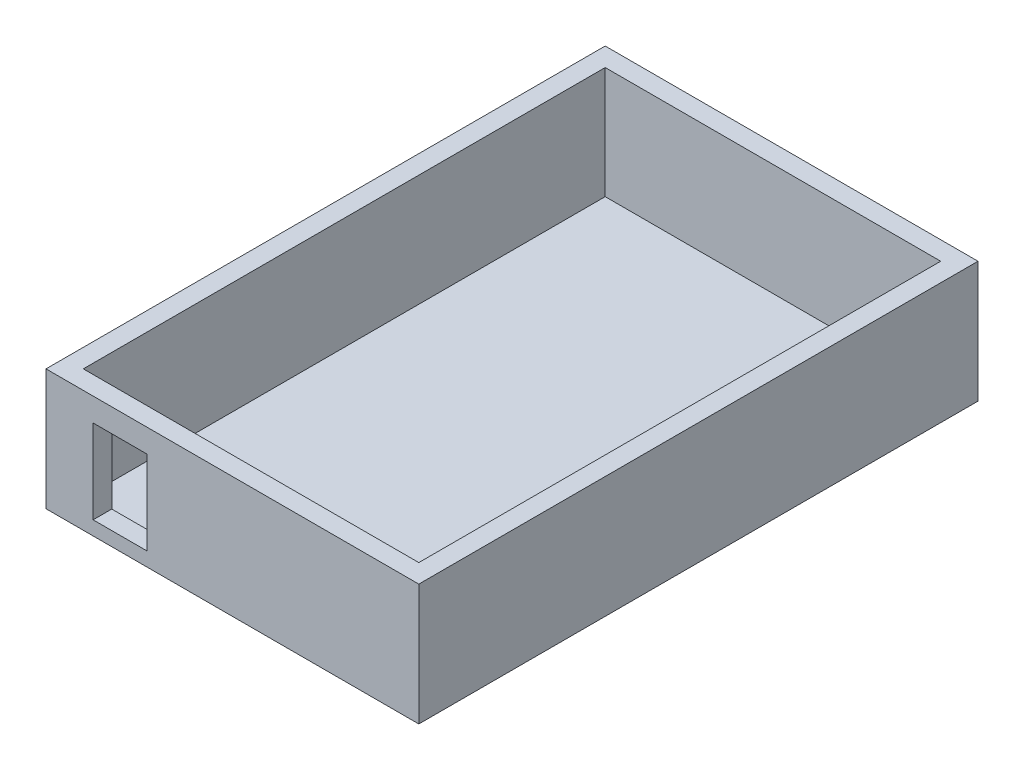
ISO-10303-21;
HEADER;
FILE_DESCRIPTION(('STEP AP214'),'2;1');
FILE_NAME('part.step','',(''),(''),'','','');
FILE_SCHEMA(('AUTOMOTIVE_DESIGN { 1 0 10303 214 1 1 1 1 }'));
ENDSEC;
DATA;
#1=APPLICATION_CONTEXT('core data for automotive mechanical design processes');
#2=APPLICATION_PROTOCOL_DEFINITION('international standard','automotive_design',2000,#1);
#3=PRODUCT_CONTEXT('',#1,'mechanical');
#4=PRODUCT('Part','Part','',(#3));
#5=PRODUCT_RELATED_PRODUCT_CATEGORY('part','',(#4));
#6=PRODUCT_DEFINITION_FORMATION('','',#4);
#7=PRODUCT_DEFINITION_CONTEXT('part definition',#1,'design');
#8=PRODUCT_DEFINITION('design','',#6,#7);
#9=PRODUCT_DEFINITION_SHAPE('','',#8);
#10=(LENGTH_UNIT() NAMED_UNIT(*) SI_UNIT(.MILLI.,.METRE.));
#11=(NAMED_UNIT(*) PLANE_ANGLE_UNIT() SI_UNIT($,.RADIAN.));
#12=(NAMED_UNIT(*) SI_UNIT($,.STERADIAN.) SOLID_ANGLE_UNIT());
#13=UNCERTAINTY_MEASURE_WITH_UNIT(LENGTH_MEASURE(1.E-05),#10,'distance_accuracy_value','');
#14=(GEOMETRIC_REPRESENTATION_CONTEXT(3) GLOBAL_UNCERTAINTY_ASSIGNED_CONTEXT((#13)) GLOBAL_UNIT_ASSIGNED_CONTEXT((#10,
#11,#12)) REPRESENTATION_CONTEXT('',''));
#15=CARTESIAN_POINT('',(0.,0.,0.));
#16=DIRECTION('',(0.,0.,1.));
#17=DIRECTION('',(1.,0.,0.));
#18=AXIS2_PLACEMENT_3D('',#15,#16,#17);
#19=CARTESIAN_POINT('',(0.,250.,0.));
#20=DIRECTION('',(0.,1.,0.));
#21=DIRECTION('',(0.,0.,1.));
#22=AXIS2_PLACEMENT_3D('',#19,#20,#21);
#23=PLANE('',#22);
#24=DIRECTION('',(0.,0.,1.));
#25=VECTOR('',#24,1.);
#26=CARTESIAN_POINT('',(-399.833055091823,250.,-14442.4040066778));
#27=LINE('',#26,#25);
#28=CARTESIAN_POINT('',(-399.833055091823,250.,-14442.4040066778));
#29=VERTEX_POINT('',#28);
#30=CARTESIAN_POINT('',(-399.833055091821,250.,-442.404006677796));
#31=VERTEX_POINT('',#30);
#32=EDGE_CURVE('E186',#29,#31,#27,.T.);
#33=ORIENTED_EDGE('',*,*,#32,.F.);
#34=DIRECTION('',(1.,0.,0.));
#35=VECTOR('',#34,1.);
#36=CARTESIAN_POINT('',(-9899.83305509182,250.,-14442.4040066778));
#37=LINE('',#36,#35);
#38=CARTESIAN_POINT('',(-9399.83305509182,250.,-14442.4040066778));
#39=VERTEX_POINT('',#38);
#40=EDGE_CURVE('E177',#39,#29,#37,.T.);
#41=ORIENTED_EDGE('',*,*,#40,.F.);
#42=DIRECTION('',(0.,0.,-1.));
#43=VECTOR('',#42,1.);
#44=CARTESIAN_POINT('',(-9399.83305509182,250.,-14442.4040066778));
#45=LINE('',#44,#43);
#46=CARTESIAN_POINT('',(-9399.83305509182,250.,-442.404006677809));
#47=VERTEX_POINT('',#46);
#48=EDGE_CURVE('E200',#47,#39,#45,.T.);
#49=ORIENTED_EDGE('',*,*,#48,.F.);
#50=DIRECTION('',(-1.,0.,0.));
#51=VECTOR('',#50,1.);
#52=CARTESIAN_POINT('',(-9899.83305509182,250.,-442.404006677796));
#53=LINE('',#52,#51);
#54=EDGE_CURVE('E218',#31,#47,#53,.T.);
#55=ORIENTED_EDGE('',*,*,#54,.F.);
#56=EDGE_LOOP('',(#33,#41,#49,#55));
#57=FACE_BOUND('',#56,.T.);
#58=ADVANCED_FACE('F39',(#57),#23,.T.);
#59=CARTESIAN_POINT('',(-9899.83305509182,3250.,-442.404006677796));
#60=DIRECTION('',(0.,0.,1.));
#61=DIRECTION('',(1.,0.,0.));
#62=AXIS2_PLACEMENT_3D('',#59,#60,#61);
#63=PLANE('',#62);
#64=DIRECTION('',(1.,0.,0.));
#65=VECTOR('',#64,1.);
#66=CARTESIAN_POINT('',(-9899.83305509182,374.999999999997,-442.404006677796));
#67=LINE('',#66,#65);
#68=CARTESIAN_POINT('',(-8636.05304999143,374.999999999998,-442.404006677796));
#69=VERTEX_POINT('',#68);
#70=CARTESIAN_POINT('',(-7188.26780196783,374.999999999998,-442.404006677796));
#71=VERTEX_POINT('',#70);
#72=EDGE_CURVE('E169',#69,#71,#67,.T.);
#73=ORIENTED_EDGE('',*,*,#72,.T.);
#74=DIRECTION('',(0.,1.,0.));
#75=VECTOR('',#74,1.);
#76=CARTESIAN_POINT('',(-7188.26780196784,3250.,-442.404006677796));
#77=LINE('',#76,#75);
#78=CARTESIAN_POINT('',(-7188.26780196784,2625.,-442.404006677796));
#79=VERTEX_POINT('',#78);
#80=EDGE_CURVE('E173',#71,#79,#77,.T.);
#81=ORIENTED_EDGE('',*,*,#80,.T.);
#82=DIRECTION('',(-1.,0.,0.));
#83=VECTOR('',#82,1.);
#84=CARTESIAN_POINT('',(-9899.83305509182,2625.,-442.404006677796));
#85=LINE('',#84,#83);
#86=CARTESIAN_POINT('',(-8636.05304999143,2625.,-442.404006677796));
#87=VERTEX_POINT('',#86);
#88=EDGE_CURVE('E160',#79,#87,#85,.T.);
#89=ORIENTED_EDGE('',*,*,#88,.T.);
#90=DIRECTION('',(0.,-1.,0.));
#91=VECTOR('',#90,1.);
#92=CARTESIAN_POINT('',(-8636.05304999143,3250.,-442.404006677796));
#93=LINE('',#92,#91);
#94=EDGE_CURVE('E135',#87,#69,#93,.T.);
#95=ORIENTED_EDGE('',*,*,#94,.T.);
#96=EDGE_LOOP('',(#73,#81,#89,#95));
#97=FACE_BOUND('',#96,.T.);
#98=DIRECTION('',(0.,-1.,0.));
#99=VECTOR('',#98,1.);
#100=CARTESIAN_POINT('',(-399.833055091821,3250.,-442.404006677796));
#101=LINE('',#100,#99);
#102=CARTESIAN_POINT('',(-399.83305509182,3250.,-442.404006677796));
#103=VERTEX_POINT('',#102);
#104=EDGE_CURVE('E193',#103,#31,#101,.T.);
#105=ORIENTED_EDGE('',*,*,#104,.T.);
#106=ORIENTED_EDGE('',*,*,#54,.T.);
#107=DIRECTION('',(0.,-1.,0.));
#108=VECTOR('',#107,1.);
#109=CARTESIAN_POINT('',(-9399.83305509182,3250.,-442.404006677809));
#110=LINE('',#109,#108);
#111=CARTESIAN_POINT('',(-9399.83305509182,3250.,-442.404006677809));
#112=VERTEX_POINT('',#111);
#113=EDGE_CURVE('E208',#112,#47,#110,.T.);
#114=ORIENTED_EDGE('',*,*,#113,.F.);
#115=DIRECTION('',(-1.,0.,0.));
#116=VECTOR('',#115,1.);
#117=CARTESIAN_POINT('',(-9899.83305509182,3250.,-442.404006677796));
#118=LINE('',#117,#116);
#119=EDGE_CURVE('E223',#103,#112,#118,.T.);
#120=ORIENTED_EDGE('',*,*,#119,.F.);
#121=EDGE_LOOP('',(#105,#106,#114,#120));
#122=FACE_BOUND('',#121,.T.);
#123=ADVANCED_FACE('F281',(#97,#122),#63,.F.);
#124=CARTESIAN_POINT('',(100.166944908178,250.,-14942.4040066778));
#125=DIRECTION('',(-1.,0.,0.));
#126=DIRECTION('',(0.,0.,1.));
#127=AXIS2_PLACEMENT_3D('',#124,#125,#126);
#128=PLANE('',#127);
#129=DIRECTION('',(0.,-1.,0.));
#130=VECTOR('',#129,1.);
#131=CARTESIAN_POINT('',(100.166944908178,250.,-14942.4040066778));
#132=LINE('',#131,#130);
#133=CARTESIAN_POINT('',(100.166944908178,3250.,-14942.4040066778));
#134=VERTEX_POINT('',#133);
#135=CARTESIAN_POINT('',(100.166944908178,0.,-14942.4040066778));
#136=VERTEX_POINT('',#135);
#137=EDGE_CURVE('E11',#134,#136,#132,.T.);
#138=ORIENTED_EDGE('',*,*,#137,.F.);
#139=DIRECTION('',(0.,0.,-1.));
#140=VECTOR('',#139,1.);
#141=CARTESIAN_POINT('',(100.16694490818,3250.,-442.404006677796));
#142=LINE('',#141,#140);
#143=CARTESIAN_POINT('',(100.16694490818,3250.,57.5959933222037));
#144=VERTEX_POINT('',#143);
#145=EDGE_CURVE('E219',#144,#134,#142,.T.);
#146=ORIENTED_EDGE('',*,*,#145,.F.);
#147=DIRECTION('',(0.,-1.,0.));
#148=VECTOR('',#147,1.);
#149=CARTESIAN_POINT('',(100.16694490818,250.,57.5959933222037));
#150=LINE('',#149,#148);
#151=CARTESIAN_POINT('',(100.16694490818,0.,57.5959933222037));
#152=VERTEX_POINT('',#151);
#153=EDGE_CURVE('E249',#144,#152,#150,.T.);
#154=ORIENTED_EDGE('',*,*,#153,.T.);
#155=DIRECTION('',(0.,0.,-1.));
#156=VECTOR('',#155,1.);
#157=CARTESIAN_POINT('',(100.166944908178,0.,-14942.4040066778));
#158=LINE('',#157,#156);
#159=EDGE_CURVE('E234',#152,#136,#158,.T.);
#160=ORIENTED_EDGE('',*,*,#159,.T.);
#161=EDGE_LOOP('',(#138,#146,#154,#160));
#162=FACE_BOUND('',#161,.T.);
#163=ADVANCED_FACE('F41',(#162),#128,.F.);
#164=CARTESIAN_POINT('',(-9899.83305509182,250.,-14942.4040066778));
#165=DIRECTION('',(0.,0.,1.));
#166=DIRECTION('',(1.,0.,0.));
#167=AXIS2_PLACEMENT_3D('',#164,#165,#166);
#168=PLANE('',#167);
#169=DIRECTION('',(-1.,0.,0.));
#170=VECTOR('',#169,1.);
#171=CARTESIAN_POINT('',(-9899.83305509182,0.,-14942.4040066778));
#172=LINE('',#171,#170);
#173=CARTESIAN_POINT('',(-9899.83305509182,0.,-14942.4040066778));
#174=VERTEX_POINT('',#173);
#175=EDGE_CURVE('E240',#136,#174,#172,.T.);
#176=ORIENTED_EDGE('',*,*,#175,.T.);
#177=DIRECTION('',(0.,-1.,0.));
#178=VECTOR('',#177,1.);
#179=CARTESIAN_POINT('',(-9899.83305509182,250.,-14942.4040066778));
#180=LINE('',#179,#178);
#181=CARTESIAN_POINT('',(-9899.83305509182,3250.,-14942.4040066778));
#182=VERTEX_POINT('',#181);
#183=EDGE_CURVE('E48',#182,#174,#180,.T.);
#184=ORIENTED_EDGE('',*,*,#183,.F.);
#185=DIRECTION('',(-1.,0.,0.));
#186=VECTOR('',#185,1.);
#187=CARTESIAN_POINT('',(-9899.83305509182,3250.,-14942.4040066778));
#188=LINE('',#187,#186);
#189=EDGE_CURVE('E178',#134,#182,#188,.T.);
#190=ORIENTED_EDGE('',*,*,#189,.F.);
#191=ORIENTED_EDGE('',*,*,#137,.T.);
#192=EDGE_LOOP('',(#176,#184,#190,#191));
#193=FACE_BOUND('',#192,.T.);
#194=ADVANCED_FACE('F274',(#193),#168,.F.);
#195=CARTESIAN_POINT('',(-9899.83305509182,250.,-14942.4040066778));
#196=DIRECTION('',(1.,0.,0.));
#197=DIRECTION('',(0.,0.,-1.));
#198=AXIS2_PLACEMENT_3D('',#195,#196,#197);
#199=PLANE('',#198);
#200=DIRECTION('',(0.,0.,1.));
#201=VECTOR('',#200,1.);
#202=CARTESIAN_POINT('',(-9899.83305509182,0.,-14942.4040066778));
#203=LINE('',#202,#201);
#204=CARTESIAN_POINT('',(-9899.83305509182,0.,57.5959933222037));
#205=VERTEX_POINT('',#204);
#206=EDGE_CURVE('E243',#174,#205,#203,.T.);
#207=ORIENTED_EDGE('',*,*,#206,.T.);
#208=DIRECTION('',(0.,-1.,0.));
#209=VECTOR('',#208,1.);
#210=CARTESIAN_POINT('',(-9899.83305509182,250.,57.5959933222037));
#211=LINE('',#210,#209);
#212=CARTESIAN_POINT('',(-9899.83305509182,3250.,57.5959933222037));
#213=VERTEX_POINT('',#212);
#214=EDGE_CURVE('E253',#213,#205,#211,.T.);
#215=ORIENTED_EDGE('',*,*,#214,.F.);
#216=DIRECTION('',(0.,0.,1.));
#217=VECTOR('',#216,1.);
#218=CARTESIAN_POINT('',(-9899.83305509182,3250.,-442.404006677796));
#219=LINE('',#218,#217);
#220=EDGE_CURVE('E226',#182,#213,#219,.T.);
#221=ORIENTED_EDGE('',*,*,#220,.F.);
#222=ORIENTED_EDGE('',*,*,#183,.T.);
#223=EDGE_LOOP('',(#207,#215,#221,#222));
#224=FACE_BOUND('',#223,.T.);
#225=ADVANCED_FACE('F261',(#224),#199,.F.);
#226=CARTESIAN_POINT('',(-9899.83305509182,250.,57.5959933222037));
#227=DIRECTION('',(0.,0.,-1.));
#228=DIRECTION('',(-1.,0.,0.));
#229=AXIS2_PLACEMENT_3D('',#226,#227,#228);
#230=PLANE('',#229);
#231=DIRECTION('',(-1.,0.,0.));
#232=VECTOR('',#231,1.);
#233=CARTESIAN_POINT('',(-8636.05304999143,2625.,57.5959933222037));
#234=LINE('',#233,#232);
#235=CARTESIAN_POINT('',(-7188.26780196784,2625.,57.5959933222037));
#236=VERTEX_POINT('',#235);
#237=CARTESIAN_POINT('',(-8636.05304999143,2625.,57.5959933222037));
#238=VERTEX_POINT('',#237);
#239=EDGE_CURVE('E142',#236,#238,#234,.T.);
#240=ORIENTED_EDGE('',*,*,#239,.F.);
#241=DIRECTION('',(0.,1.,0.));
#242=VECTOR('',#241,1.);
#243=CARTESIAN_POINT('',(-7188.26780196784,2625.,57.5959933222037));
#244=LINE('',#243,#242);
#245=CARTESIAN_POINT('',(-7188.26780196783,374.999999999998,57.5959933222037));
#246=VERTEX_POINT('',#245);
#247=EDGE_CURVE('E63',#246,#236,#244,.T.);
#248=ORIENTED_EDGE('',*,*,#247,.F.);
#249=DIRECTION('',(1.,0.,0.));
#250=VECTOR('',#249,1.);
#251=CARTESIAN_POINT('',(-8636.05304999143,374.999999999998,57.5959933222037));
#252=LINE('',#251,#250);
#253=CARTESIAN_POINT('',(-8636.05304999143,374.999999999998,57.5959933222037));
#254=VERTEX_POINT('',#253);
#255=EDGE_CURVE('E150',#254,#246,#252,.T.);
#256=ORIENTED_EDGE('',*,*,#255,.F.);
#257=DIRECTION('',(0.,-1.,0.));
#258=VECTOR('',#257,1.);
#259=CARTESIAN_POINT('',(-8636.05304999143,2625.,57.5959933222037));
#260=LINE('',#259,#258);
#261=EDGE_CURVE('E132',#238,#254,#260,.T.);
#262=ORIENTED_EDGE('',*,*,#261,.F.);
#263=EDGE_LOOP('',(#240,#248,#256,#262));
#264=FACE_BOUND('',#263,.T.);
#265=DIRECTION('',(1.,0.,0.));
#266=VECTOR('',#265,1.);
#267=CARTESIAN_POINT('',(-9899.83305509182,0.,57.5959933222037));
#268=LINE('',#267,#266);
#269=EDGE_CURVE('E246',#205,#152,#268,.T.);
#270=ORIENTED_EDGE('',*,*,#269,.T.);
#271=ORIENTED_EDGE('',*,*,#153,.F.);
#272=DIRECTION('',(1.,0.,0.));
#273=VECTOR('',#272,1.);
#274=CARTESIAN_POINT('',(-9899.83305509182,3250.,57.5959933222037));
#275=LINE('',#274,#273);
#276=EDGE_CURVE('E230',#213,#144,#275,.T.);
#277=ORIENTED_EDGE('',*,*,#276,.F.);
#278=ORIENTED_EDGE('',*,*,#214,.T.);
#279=EDGE_LOOP('',(#270,#271,#277,#278));
#280=FACE_BOUND('',#279,.T.);
#281=ADVANCED_FACE('F147',(#264,#280),#230,.F.);
#282=CARTESIAN_POINT('',(0.,0.,0.));
#283=DIRECTION('',(0.,1.,0.));
#284=DIRECTION('',(0.,0.,1.));
#285=AXIS2_PLACEMENT_3D('',#282,#283,#284);
#286=PLANE('',#285);
#287=ORIENTED_EDGE('',*,*,#159,.F.);
#288=ORIENTED_EDGE('',*,*,#269,.F.);
#289=ORIENTED_EDGE('',*,*,#206,.F.);
#290=ORIENTED_EDGE('',*,*,#175,.F.);
#291=EDGE_LOOP('',(#287,#288,#289,#290));
#292=FACE_BOUND('',#291,.T.);
#293=ADVANCED_FACE('F267',(#292),#286,.F.);
#294=CARTESIAN_POINT('',(0.,3250.,0.));
#295=DIRECTION('',(0.,1.,0.));
#296=DIRECTION('',(0.,0.,1.));
#297=AXIS2_PLACEMENT_3D('',#294,#295,#296);
#298=PLANE('',#297);
#299=ORIENTED_EDGE('',*,*,#189,.T.);
#300=ORIENTED_EDGE('',*,*,#220,.T.);
#301=ORIENTED_EDGE('',*,*,#276,.T.);
#302=ORIENTED_EDGE('',*,*,#145,.T.);
#303=EDGE_LOOP('',(#299,#300,#301,#302));
#304=FACE_BOUND('',#303,.T.);
#305=DIRECTION('',(0.,0.,-1.));
#306=VECTOR('',#305,1.);
#307=CARTESIAN_POINT('',(-9399.83305509182,3250.,-14442.4040066778));
#308=LINE('',#307,#306);
#309=CARTESIAN_POINT('',(-9399.83305509182,3250.,-14442.4040066778));
#310=VERTEX_POINT('',#309);
#311=EDGE_CURVE('E204',#112,#310,#308,.T.);
#312=ORIENTED_EDGE('',*,*,#311,.T.);
#313=DIRECTION('',(1.,0.,0.));
#314=VECTOR('',#313,1.);
#315=CARTESIAN_POINT('',(-9899.83305509182,3250.,-14442.4040066778));
#316=LINE('',#315,#314);
#317=CARTESIAN_POINT('',(-399.833055091822,3250.,-14442.4040066778));
#318=VERTEX_POINT('',#317);
#319=EDGE_CURVE('E182',#310,#318,#316,.T.);
#320=ORIENTED_EDGE('',*,*,#319,.T.);
#321=DIRECTION('',(0.,0.,1.));
#322=VECTOR('',#321,1.);
#323=CARTESIAN_POINT('',(-399.833055091823,3250.,-14442.4040066778));
#324=LINE('',#323,#322);
#325=EDGE_CURVE('E189',#318,#103,#324,.T.);
#326=ORIENTED_EDGE('',*,*,#325,.T.);
#327=ORIENTED_EDGE('',*,*,#119,.T.);
#328=EDGE_LOOP('',(#312,#320,#326,#327));
#329=FACE_BOUND('',#328,.T.);
#330=ADVANCED_FACE('F272',(#304,#329),#298,.T.);
#331=CARTESIAN_POINT('',(-9399.83305509182,3250.,-14442.4040066778));
#332=DIRECTION('',(-1.,0.,0.));
#333=DIRECTION('',(0.,0.,1.));
#334=AXIS2_PLACEMENT_3D('',#331,#332,#333);
#335=PLANE('',#334);
#336=ORIENTED_EDGE('',*,*,#48,.T.);
#337=DIRECTION('',(0.,-1.,0.));
#338=VECTOR('',#337,1.);
#339=CARTESIAN_POINT('',(-9399.83305509182,3250.,-14442.4040066778));
#340=LINE('',#339,#338);
#341=EDGE_CURVE('E215',#310,#39,#340,.T.);
#342=ORIENTED_EDGE('',*,*,#341,.F.);
#343=ORIENTED_EDGE('',*,*,#311,.F.);
#344=ORIENTED_EDGE('',*,*,#113,.T.);
#345=EDGE_LOOP('',(#336,#342,#343,#344));
#346=FACE_BOUND('',#345,.T.);
#347=ADVANCED_FACE('F312',(#346),#335,.F.);
#348=CARTESIAN_POINT('',(-399.833055091823,3250.,-14442.4040066778));
#349=DIRECTION('',(1.,0.,0.));
#350=DIRECTION('',(0.,0.,-1.));
#351=AXIS2_PLACEMENT_3D('',#348,#349,#350);
#352=PLANE('',#351);
#353=ORIENTED_EDGE('',*,*,#32,.T.);
#354=ORIENTED_EDGE('',*,*,#104,.F.);
#355=ORIENTED_EDGE('',*,*,#325,.F.);
#356=DIRECTION('',(0.,-1.,0.));
#357=VECTOR('',#356,1.);
#358=CARTESIAN_POINT('',(-399.833055091823,3250.,-14442.4040066778));
#359=LINE('',#358,#357);
#360=EDGE_CURVE('E196',#318,#29,#359,.T.);
#361=ORIENTED_EDGE('',*,*,#360,.T.);
#362=EDGE_LOOP('',(#353,#354,#355,#361));
#363=FACE_BOUND('',#362,.T.);
#364=ADVANCED_FACE('F318',(#363),#352,.F.);
#365=CARTESIAN_POINT('',(-9899.83305509182,3250.,-14442.4040066778));
#366=DIRECTION('',(0.,0.,-1.));
#367=DIRECTION('',(-1.,0.,0.));
#368=AXIS2_PLACEMENT_3D('',#365,#366,#367);
#369=PLANE('',#368);
#370=ORIENTED_EDGE('',*,*,#319,.F.);
#371=ORIENTED_EDGE('',*,*,#341,.T.);
#372=ORIENTED_EDGE('',*,*,#40,.T.);
#373=ORIENTED_EDGE('',*,*,#360,.F.);
#374=EDGE_LOOP('',(#370,#371,#372,#373));
#375=FACE_BOUND('',#374,.T.);
#376=ADVANCED_FACE('F326',(#375),#369,.F.);
#377=CARTESIAN_POINT('',(-7188.26780196784,2625.,-1942.4040066778));
#378=DIRECTION('',(1.,0.,0.));
#379=DIRECTION('',(0.,1.,0.));
#380=AXIS2_PLACEMENT_3D('',#377,#378,#379);
#381=PLANE('',#380);
#382=DIRECTION('',(0.,0.,1.));
#383=VECTOR('',#382,1.);
#384=CARTESIAN_POINT('',(-7188.26780196783,374.999999999998,-1942.4040066778));
#385=LINE('',#384,#383);
#386=EDGE_CURVE('E157',#71,#246,#385,.T.);
#387=ORIENTED_EDGE('',*,*,#386,.T.);
#388=ORIENTED_EDGE('',*,*,#247,.T.);
#389=DIRECTION('',(0.,0.,1.));
#390=VECTOR('',#389,1.);
#391=CARTESIAN_POINT('',(-7188.26780196784,2625.,-1942.4040066778));
#392=LINE('',#391,#390);
#393=EDGE_CURVE('E139',#79,#236,#392,.T.);
#394=ORIENTED_EDGE('',*,*,#393,.F.);
#395=ORIENTED_EDGE('',*,*,#80,.F.);
#396=EDGE_LOOP('',(#387,#388,#394,#395));
#397=FACE_BOUND('',#396,.T.);
#398=ADVANCED_FACE('F334',(#397),#381,.F.);
#399=CARTESIAN_POINT('',(-8636.05304999143,374.999999999998,-1942.4040066778));
#400=DIRECTION('',(0.,-1.,0.));
#401=DIRECTION('',(1.,0.,0.));
#402=AXIS2_PLACEMENT_3D('',#399,#400,#401);
#403=PLANE('',#402);
#404=DIRECTION('',(0.,0.,1.));
#405=VECTOR('',#404,1.);
#406=CARTESIAN_POINT('',(-8636.05304999143,374.999999999998,-1942.4040066778));
#407=LINE('',#406,#405);
#408=EDGE_CURVE('E138',#69,#254,#407,.T.);
#409=ORIENTED_EDGE('',*,*,#408,.T.);
#410=ORIENTED_EDGE('',*,*,#255,.T.);
#411=ORIENTED_EDGE('',*,*,#386,.F.);
#412=ORIENTED_EDGE('',*,*,#72,.F.);
#413=EDGE_LOOP('',(#409,#410,#411,#412));
#414=FACE_BOUND('',#413,.T.);
#415=ADVANCED_FACE('F341',(#414),#403,.F.);
#416=CARTESIAN_POINT('',(-8636.05304999143,2625.,-1942.4040066778));
#417=DIRECTION('',(-1.,0.,0.));
#418=DIRECTION('',(0.,0.,1.));
#419=AXIS2_PLACEMENT_3D('',#416,#417,#418);
#420=PLANE('',#419);
#421=DIRECTION('',(0.,0.,1.));
#422=VECTOR('',#421,1.);
#423=CARTESIAN_POINT('',(-8636.05304999143,2625.,-1942.4040066778));
#424=LINE('',#423,#422);
#425=EDGE_CURVE('E55',#87,#238,#424,.T.);
#426=ORIENTED_EDGE('',*,*,#425,.T.);
#427=ORIENTED_EDGE('',*,*,#261,.T.);
#428=ORIENTED_EDGE('',*,*,#408,.F.);
#429=ORIENTED_EDGE('',*,*,#94,.F.);
#430=EDGE_LOOP('',(#426,#427,#428,#429));
#431=FACE_BOUND('',#430,.T.);
#432=ADVANCED_FACE('F129',(#431),#420,.F.);
#433=CARTESIAN_POINT('',(-8636.05304999143,2625.,-1942.4040066778));
#434=DIRECTION('',(0.,1.,0.));
#435=DIRECTION('',(-1.,0.,0.));
#436=AXIS2_PLACEMENT_3D('',#433,#434,#435);
#437=PLANE('',#436);
#438=ORIENTED_EDGE('',*,*,#393,.T.);
#439=ORIENTED_EDGE('',*,*,#239,.T.);
#440=ORIENTED_EDGE('',*,*,#425,.F.);
#441=ORIENTED_EDGE('',*,*,#88,.F.);
#442=EDGE_LOOP('',(#438,#439,#440,#441));
#443=FACE_BOUND('',#442,.T.);
#444=ADVANCED_FACE('F143',(#443),#437,.F.);
#445=CLOSED_SHELL('',(#58,#123,#163,#194,#225,#281,#293,#330,#347,#364,#376,#398,#415,#432,#444));
#446=MANIFOLD_SOLID_BREP('B2',#445);
#447=ADVANCED_BREP_SHAPE_REPRESENTATION('',(#18,#446),#14);
#448=SHAPE_DEFINITION_REPRESENTATION(#9,#447);
ENDSEC;
END-ISO-10303-21;
